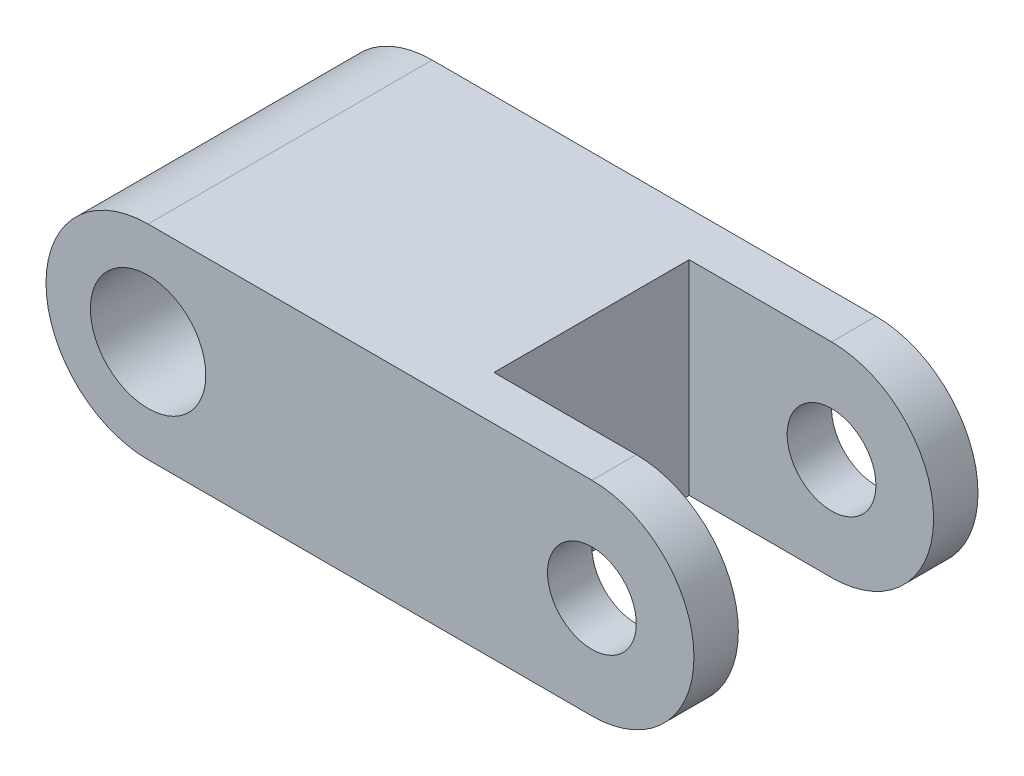
ISO-10303-21;
HEADER;
FILE_DESCRIPTION(('STEP AP214'),'2;1');
FILE_NAME('part.step','',(''),(''),'','','');
FILE_SCHEMA(('AUTOMOTIVE_DESIGN { 1 0 10303 214 1 1 1 1 }'));
ENDSEC;
DATA;
#1=APPLICATION_CONTEXT('core data for automotive mechanical design processes');
#2=APPLICATION_PROTOCOL_DEFINITION('international standard','automotive_design',2000,#1);
#3=PRODUCT_CONTEXT('',#1,'mechanical');
#4=PRODUCT('Part','Part','',(#3));
#5=PRODUCT_RELATED_PRODUCT_CATEGORY('part','',(#4));
#6=PRODUCT_DEFINITION_FORMATION('','',#4);
#7=PRODUCT_DEFINITION_CONTEXT('part definition',#1,'design');
#8=PRODUCT_DEFINITION('design','',#6,#7);
#9=PRODUCT_DEFINITION_SHAPE('','',#8);
#10=(LENGTH_UNIT() NAMED_UNIT(*) SI_UNIT(.MILLI.,.METRE.));
#11=(NAMED_UNIT(*) PLANE_ANGLE_UNIT() SI_UNIT($,.RADIAN.));
#12=(NAMED_UNIT(*) SI_UNIT($,.STERADIAN.) SOLID_ANGLE_UNIT());
#13=UNCERTAINTY_MEASURE_WITH_UNIT(LENGTH_MEASURE(1.E-05),#10,'distance_accuracy_value','');
#14=(GEOMETRIC_REPRESENTATION_CONTEXT(3) GLOBAL_UNCERTAINTY_ASSIGNED_CONTEXT((#13)) GLOBAL_UNIT_ASSIGNED_CONTEXT((#10,
#11,#12)) REPRESENTATION_CONTEXT('',''));
#15=CARTESIAN_POINT('',(0.,0.,0.));
#16=DIRECTION('',(0.,0.,1.));
#17=DIRECTION('',(1.,0.,0.));
#18=AXIS2_PLACEMENT_3D('',#15,#16,#17);
#19=CARTESIAN_POINT('',(50.,0.,-32.));
#20=DIRECTION('',(0.,0.,1.));
#21=DIRECTION('',(-1.,0.,0.));
#22=AXIS2_PLACEMENT_3D('',#19,#20,#21);
#23=CYLINDRICAL_SURFACE('',#22,11.5);
#24=DIRECTION('',(0.,0.,1.));
#25=VECTOR('',#24,1.);
#26=CARTESIAN_POINT('',(50.,-11.5,-32.));
#27=LINE('',#26,#25);
#28=CARTESIAN_POINT('',(50.,-11.5,-32.));
#29=VERTEX_POINT('',#28);
#30=CARTESIAN_POINT('',(50.,-11.5,-27.));
#31=VERTEX_POINT('',#30);
#32=EDGE_CURVE('E43',#29,#31,#27,.T.);
#33=ORIENTED_EDGE('',*,*,#32,.F.);
#34=CARTESIAN_POINT('',(50.,0.,-32.));
#35=DIRECTION('',(0.,0.,1.));
#36=DIRECTION('',(1.,0.,0.));
#37=AXIS2_PLACEMENT_3D('',#34,#35,#36);
#38=CIRCLE('',#37,11.5);
#39=CARTESIAN_POINT('',(50.,11.5,-32.));
#40=VERTEX_POINT('',#39);
#41=EDGE_CURVE('E129',#29,#40,#38,.T.);
#42=ORIENTED_EDGE('',*,*,#41,.T.);
#43=DIRECTION('',(0.,0.,1.));
#44=VECTOR('',#43,1.);
#45=CARTESIAN_POINT('',(50.,11.5,-32.));
#46=LINE('',#45,#44);
#47=CARTESIAN_POINT('',(50.,11.5,-27.));
#48=VERTEX_POINT('',#47);
#49=EDGE_CURVE('E110',#40,#48,#46,.T.);
#50=ORIENTED_EDGE('',*,*,#49,.T.);
#51=CARTESIAN_POINT('',(50.,0.,-27.));
#52=DIRECTION('',(0.,0.,1.));
#53=DIRECTION('',(1.,0.,0.));
#54=AXIS2_PLACEMENT_3D('',#51,#52,#53);
#55=CIRCLE('',#54,11.5);
#56=EDGE_CURVE('E118',#48,#31,#55,.F.);
#57=ORIENTED_EDGE('',*,*,#56,.T.);
#58=EDGE_LOOP('',(#33,#42,#50,#57));
#59=FACE_BOUND('',#58,.T.);
#60=ADVANCED_FACE('F35',(#59),#23,.T.);
#61=CARTESIAN_POINT('',(50.,0.,-32.));
#62=DIRECTION('',(0.,0.,1.));
#63=DIRECTION('',(-1.,0.,0.));
#64=AXIS2_PLACEMENT_3D('',#61,#62,#63);
#65=CYLINDRICAL_SURFACE('',#64,5.);
#66=CARTESIAN_POINT('',(50.,0.,-27.));
#67=DIRECTION('',(0.,0.,1.));
#68=DIRECTION('',(1.,0.,0.));
#69=AXIS2_PLACEMENT_3D('',#66,#67,#68);
#70=CIRCLE('',#69,5.);
#71=CARTESIAN_POINT('',(55.,0.,-27.));
#72=VERTEX_POINT('',#71);
#73=EDGE_CURVE('E179',#72,#72,#70,.F.);
#74=ORIENTED_EDGE('',*,*,#73,.F.);
#75=EDGE_LOOP('',(#74));
#76=FACE_BOUND('',#75,.T.);
#77=CARTESIAN_POINT('',(50.,0.,-32.));
#78=DIRECTION('',(0.,0.,1.));
#79=DIRECTION('',(1.,0.,0.));
#80=AXIS2_PLACEMENT_3D('',#77,#78,#79);
#81=CIRCLE('',#80,5.);
#82=CARTESIAN_POINT('',(55.,0.,-32.));
#83=VERTEX_POINT('',#82);
#84=EDGE_CURVE('E165',#83,#83,#81,.T.);
#85=ORIENTED_EDGE('',*,*,#84,.F.);
#86=EDGE_LOOP('',(#85));
#87=FACE_BOUND('',#86,.T.);
#88=ADVANCED_FACE('F212',(#76,#87),#65,.F.);
#89=CARTESIAN_POINT('',(0.,0.,-32.));
#90=DIRECTION('',(0.,0.,-1.));
#91=DIRECTION('',(1.,0.,0.));
#92=AXIS2_PLACEMENT_3D('',#89,#90,#91);
#93=PLANE('',#92);
#94=CARTESIAN_POINT('',(0.,0.,-32.));
#95=DIRECTION('',(0.,0.,1.));
#96=DIRECTION('',(1.,0.,0.));
#97=AXIS2_PLACEMENT_3D('',#94,#95,#96);
#98=CIRCLE('',#97,6.5);
#99=CARTESIAN_POINT('',(6.5,0.,-32.));
#100=VERTEX_POINT('',#99);
#101=EDGE_CURVE('E154',#100,#100,#98,.T.);
#102=ORIENTED_EDGE('',*,*,#101,.T.);
#103=EDGE_LOOP('',(#102));
#104=FACE_BOUND('',#103,.T.);
#105=CARTESIAN_POINT('',(0.,0.,-32.));
#106=DIRECTION('',(0.,0.,1.));
#107=DIRECTION('',(1.,0.,0.));
#108=AXIS2_PLACEMENT_3D('',#105,#106,#107);
#109=CIRCLE('',#108,11.5);
#110=CARTESIAN_POINT('',(0.,11.5,-32.));
#111=VERTEX_POINT('',#110);
#112=CARTESIAN_POINT('',(0.,-11.5,-32.));
#113=VERTEX_POINT('',#112);
#114=EDGE_CURVE('E141',#111,#113,#109,.T.);
#115=ORIENTED_EDGE('',*,*,#114,.F.);
#116=DIRECTION('',(-1.,0.,0.));
#117=VECTOR('',#116,1.);
#118=CARTESIAN_POINT('',(0.,11.5,-32.));
#119=LINE('',#118,#117);
#120=EDGE_CURVE('E145',#40,#111,#119,.T.);
#121=ORIENTED_EDGE('',*,*,#120,.F.);
#122=ORIENTED_EDGE('',*,*,#41,.F.);
#123=DIRECTION('',(1.,0.,0.));
#124=VECTOR('',#123,1.);
#125=CARTESIAN_POINT('',(0.,-11.5,-32.));
#126=LINE('',#125,#124);
#127=EDGE_CURVE('E138',#113,#29,#126,.T.);
#128=ORIENTED_EDGE('',*,*,#127,.F.);
#129=EDGE_LOOP('',(#115,#121,#122,#128));
#130=FACE_BOUND('',#129,.T.);
#131=ORIENTED_EDGE('',*,*,#84,.T.);
#132=EDGE_LOOP('',(#131));
#133=FACE_BOUND('',#132,.T.);
#134=ADVANCED_FACE('F143',(#104,#130,#133),#93,.T.);
#135=CARTESIAN_POINT('',(0.,0.,0.));
#136=DIRECTION('',(0.,0.,-1.));
#137=DIRECTION('',(1.,0.,0.));
#138=AXIS2_PLACEMENT_3D('',#135,#136,#137);
#139=PLANE('',#138);
#140=CARTESIAN_POINT('',(0.,0.,0.));
#141=DIRECTION('',(0.,0.,1.));
#142=DIRECTION('',(1.,0.,0.));
#143=AXIS2_PLACEMENT_3D('',#140,#141,#142);
#144=CIRCLE('',#143,11.5);
#145=CARTESIAN_POINT('',(0.,11.5,0.));
#146=VERTEX_POINT('',#145);
#147=CARTESIAN_POINT('',(0.,-11.5,0.));
#148=VERTEX_POINT('',#147);
#149=EDGE_CURVE('E150',#146,#148,#144,.T.);
#150=ORIENTED_EDGE('',*,*,#149,.T.);
#151=DIRECTION('',(1.,0.,0.));
#152=VECTOR('',#151,1.);
#153=CARTESIAN_POINT('',(0.,-11.5,0.));
#154=LINE('',#153,#152);
#155=CARTESIAN_POINT('',(50.,-11.5,0.));
#156=VERTEX_POINT('',#155);
#157=EDGE_CURVE('E153',#148,#156,#154,.T.);
#158=ORIENTED_EDGE('',*,*,#157,.T.);
#159=CARTESIAN_POINT('',(50.,0.,0.));
#160=DIRECTION('',(0.,0.,1.));
#161=DIRECTION('',(1.,0.,0.));
#162=AXIS2_PLACEMENT_3D('',#159,#160,#161);
#163=CIRCLE('',#162,11.5);
#164=CARTESIAN_POINT('',(50.,11.5,0.));
#165=VERTEX_POINT('',#164);
#166=EDGE_CURVE('E157',#156,#165,#163,.T.);
#167=ORIENTED_EDGE('',*,*,#166,.T.);
#168=DIRECTION('',(-1.,0.,0.));
#169=VECTOR('',#168,1.);
#170=CARTESIAN_POINT('',(0.,11.5,0.));
#171=LINE('',#170,#169);
#172=EDGE_CURVE('E159',#165,#146,#171,.T.);
#173=ORIENTED_EDGE('',*,*,#172,.T.);
#174=EDGE_LOOP('',(#150,#158,#167,#173));
#175=FACE_BOUND('',#174,.T.);
#176=CARTESIAN_POINT('',(0.,0.,0.));
#177=DIRECTION('',(0.,0.,1.));
#178=DIRECTION('',(1.,0.,0.));
#179=AXIS2_PLACEMENT_3D('',#176,#177,#178);
#180=CIRCLE('',#179,6.5);
#181=CARTESIAN_POINT('',(6.5,0.,0.));
#182=VERTEX_POINT('',#181);
#183=EDGE_CURVE('E162',#182,#182,#180,.T.);
#184=ORIENTED_EDGE('',*,*,#183,.F.);
#185=EDGE_LOOP('',(#184));
#186=FACE_BOUND('',#185,.T.);
#187=CARTESIAN_POINT('',(50.,0.,0.));
#188=DIRECTION('',(0.,0.,1.));
#189=DIRECTION('',(1.,0.,0.));
#190=AXIS2_PLACEMENT_3D('',#187,#188,#189);
#191=CIRCLE('',#190,5.);
#192=CARTESIAN_POINT('',(55.,0.,0.));
#193=VERTEX_POINT('',#192);
#194=EDGE_CURVE('E168',#193,#193,#191,.T.);
#195=ORIENTED_EDGE('',*,*,#194,.F.);
#196=EDGE_LOOP('',(#195));
#197=FACE_BOUND('',#196,.T.);
#198=ADVANCED_FACE('F195',(#175,#186,#197),#139,.F.);
#199=CARTESIAN_POINT('',(0.,0.,-32.));
#200=DIRECTION('',(0.,0.,1.));
#201=DIRECTION('',(-1.,0.,0.));
#202=AXIS2_PLACEMENT_3D('',#199,#200,#201);
#203=CYLINDRICAL_SURFACE('',#202,11.5);
#204=ORIENTED_EDGE('',*,*,#149,.F.);
#205=DIRECTION('',(0.,0.,1.));
#206=VECTOR('',#205,1.);
#207=CARTESIAN_POINT('',(0.,11.5,-32.));
#208=LINE('',#207,#206);
#209=EDGE_CURVE('E59',#111,#146,#208,.T.);
#210=ORIENTED_EDGE('',*,*,#209,.F.);
#211=ORIENTED_EDGE('',*,*,#114,.T.);
#212=DIRECTION('',(0.,0.,1.));
#213=VECTOR('',#212,1.);
#214=CARTESIAN_POINT('',(0.,-11.5,-32.));
#215=LINE('',#214,#213);
#216=EDGE_CURVE('E11',#113,#148,#215,.T.);
#217=ORIENTED_EDGE('',*,*,#216,.T.);
#218=EDGE_LOOP('',(#204,#210,#211,#217));
#219=FACE_BOUND('',#218,.T.);
#220=ADVANCED_FACE('F37',(#219),#203,.T.);
#221=CARTESIAN_POINT('',(0.,-11.5,-32.));
#222=DIRECTION('',(0.,1.,0.));
#223=DIRECTION('',(0.,0.,-1.));
#224=AXIS2_PLACEMENT_3D('',#221,#222,#223);
#225=PLANE('',#224);
#226=DIRECTION('',(0.,0.,1.));
#227=VECTOR('',#226,1.);
#228=CARTESIAN_POINT('',(33.9664567589803,-11.5,-5.));
#229=LINE('',#228,#227);
#230=CARTESIAN_POINT('',(33.9664567589803,-11.5,-27.));
#231=VERTEX_POINT('',#230);
#232=CARTESIAN_POINT('',(33.9664567589803,-11.5,-5.));
#233=VERTEX_POINT('',#232);
#234=EDGE_CURVE('E185',#231,#233,#229,.T.);
#235=ORIENTED_EDGE('',*,*,#234,.T.);
#236=DIRECTION('',(1.,0.,0.));
#237=VECTOR('',#236,1.);
#238=CARTESIAN_POINT('',(61.5,-11.5,-5.));
#239=LINE('',#238,#237);
#240=CARTESIAN_POINT('',(50.,-11.5,-5.));
#241=VERTEX_POINT('',#240);
#242=EDGE_CURVE('E171',#233,#241,#239,.T.);
#243=ORIENTED_EDGE('',*,*,#242,.T.);
#244=EDGE_CURVE('E130',#241,#156,#27,.T.);
#245=ORIENTED_EDGE('',*,*,#244,.T.);
#246=ORIENTED_EDGE('',*,*,#157,.F.);
#247=ORIENTED_EDGE('',*,*,#216,.F.);
#248=ORIENTED_EDGE('',*,*,#127,.T.);
#249=ORIENTED_EDGE('',*,*,#32,.T.);
#250=DIRECTION('',(-1.,0.,0.));
#251=VECTOR('',#250,1.);
#252=CARTESIAN_POINT('',(61.5,-11.5,-27.));
#253=LINE('',#252,#251);
#254=EDGE_CURVE('E121',#31,#231,#253,.T.);
#255=ORIENTED_EDGE('',*,*,#254,.T.);
#256=EDGE_LOOP('',(#235,#243,#245,#246,#247,#248,#249,#255));
#257=FACE_BOUND('',#256,.T.);
#258=ADVANCED_FACE('F136',(#257),#225,.F.);
#259=CARTESIAN_POINT('',(50.,11.5,-5.));
#260=VERTEX_POINT('',#259);
#261=EDGE_CURVE('E131',#260,#165,#46,.T.);
#262=ORIENTED_EDGE('',*,*,#261,.T.);
#263=ORIENTED_EDGE('',*,*,#166,.F.);
#264=ORIENTED_EDGE('',*,*,#244,.F.);
#265=CARTESIAN_POINT('',(50.,0.,-5.));
#266=DIRECTION('',(0.,0.,-1.));
#267=DIRECTION('',(-1.,0.,0.));
#268=AXIS2_PLACEMENT_3D('',#265,#266,#267);
#269=CIRCLE('',#268,11.5);
#270=EDGE_CURVE('E126',#241,#260,#269,.F.);
#271=ORIENTED_EDGE('',*,*,#270,.T.);
#272=EDGE_LOOP('',(#262,#263,#264,#271));
#273=FACE_BOUND('',#272,.T.);
#274=ADVANCED_FACE('F192',(#273),#23,.T.);
#275=CARTESIAN_POINT('',(0.,11.5,-32.));
#276=DIRECTION('',(0.,-1.,0.));
#277=DIRECTION('',(0.,0.,1.));
#278=AXIS2_PLACEMENT_3D('',#275,#276,#277);
#279=PLANE('',#278);
#280=ORIENTED_EDGE('',*,*,#49,.F.);
#281=ORIENTED_EDGE('',*,*,#120,.T.);
#282=ORIENTED_EDGE('',*,*,#209,.T.);
#283=ORIENTED_EDGE('',*,*,#172,.F.);
#284=ORIENTED_EDGE('',*,*,#261,.F.);
#285=DIRECTION('',(-1.,0.,0.));
#286=VECTOR('',#285,1.);
#287=CARTESIAN_POINT('',(61.5,11.5,-5.));
#288=LINE('',#287,#286);
#289=CARTESIAN_POINT('',(33.9664567589803,11.5,-5.));
#290=VERTEX_POINT('',#289);
#291=EDGE_CURVE('E50',#260,#290,#288,.T.);
#292=ORIENTED_EDGE('',*,*,#291,.T.);
#293=DIRECTION('',(0.,0.,-1.));
#294=VECTOR('',#293,1.);
#295=CARTESIAN_POINT('',(33.9664567589803,11.5,-5.));
#296=LINE('',#295,#294);
#297=CARTESIAN_POINT('',(33.9664567589803,11.5,-27.));
#298=VERTEX_POINT('',#297);
#299=EDGE_CURVE('E113',#290,#298,#296,.T.);
#300=ORIENTED_EDGE('',*,*,#299,.T.);
#301=DIRECTION('',(1.,0.,0.));
#302=VECTOR('',#301,1.);
#303=CARTESIAN_POINT('',(61.5,11.5,-27.));
#304=LINE('',#303,#302);
#305=EDGE_CURVE('E106',#298,#48,#304,.T.);
#306=ORIENTED_EDGE('',*,*,#305,.T.);
#307=EDGE_LOOP('',(#280,#281,#282,#283,#284,#292,#300,#306));
#308=FACE_BOUND('',#307,.T.);
#309=ADVANCED_FACE('F108',(#308),#279,.F.);
#310=CARTESIAN_POINT('',(0.,0.,-32.));
#311=DIRECTION('',(0.,0.,1.));
#312=DIRECTION('',(-1.,0.,0.));
#313=AXIS2_PLACEMENT_3D('',#310,#311,#312);
#314=CYLINDRICAL_SURFACE('',#313,6.5);
#315=ORIENTED_EDGE('',*,*,#101,.F.);
#316=EDGE_LOOP('',(#315));
#317=FACE_BOUND('',#316,.T.);
#318=ORIENTED_EDGE('',*,*,#183,.T.);
#319=EDGE_LOOP('',(#318));
#320=FACE_BOUND('',#319,.T.);
#321=ADVANCED_FACE('F225',(#317,#320),#314,.F.);
#322=CARTESIAN_POINT('',(50.,0.,-5.));
#323=DIRECTION('',(0.,0.,-1.));
#324=DIRECTION('',(-1.,0.,0.));
#325=AXIS2_PLACEMENT_3D('',#322,#323,#324);
#326=CIRCLE('',#325,5.);
#327=CARTESIAN_POINT('',(45.,0.,-5.));
#328=VERTEX_POINT('',#327);
#329=EDGE_CURVE('E125',#328,#328,#326,.F.);
#330=ORIENTED_EDGE('',*,*,#329,.F.);
#331=EDGE_LOOP('',(#330));
#332=FACE_BOUND('',#331,.T.);
#333=ORIENTED_EDGE('',*,*,#194,.T.);
#334=EDGE_LOOP('',(#333));
#335=FACE_BOUND('',#334,.T.);
#336=ADVANCED_FACE('F208',(#332,#335),#65,.F.);
#337=CARTESIAN_POINT('',(61.5,-11.501,-27.));
#338=DIRECTION('',(0.,0.,-1.));
#339=DIRECTION('',(1.,0.,0.));
#340=AXIS2_PLACEMENT_3D('',#337,#338,#339);
#341=PLANE('',#340);
#342=ORIENTED_EDGE('',*,*,#73,.T.);
#343=EDGE_LOOP('',(#342));
#344=FACE_BOUND('',#343,.T.);
#345=ORIENTED_EDGE('',*,*,#254,.F.);
#346=ORIENTED_EDGE('',*,*,#56,.F.);
#347=ORIENTED_EDGE('',*,*,#305,.F.);
#348=DIRECTION('',(0.,1.,0.));
#349=VECTOR('',#348,1.);
#350=CARTESIAN_POINT('',(33.9664567589803,-11.501,-27.));
#351=LINE('',#350,#349);
#352=EDGE_CURVE('E176',#231,#298,#351,.T.);
#353=ORIENTED_EDGE('',*,*,#352,.F.);
#354=EDGE_LOOP('',(#345,#346,#347,#353));
#355=FACE_BOUND('',#354,.T.);
#356=ADVANCED_FACE('F119',(#344,#355),#341,.F.);
#357=CARTESIAN_POINT('',(33.9664567589803,-11.501,-5.));
#358=DIRECTION('',(-1.,0.,0.));
#359=DIRECTION('',(0.,0.,-1.));
#360=AXIS2_PLACEMENT_3D('',#357,#358,#359);
#361=PLANE('',#360);
#362=ORIENTED_EDGE('',*,*,#234,.F.);
#363=ORIENTED_EDGE('',*,*,#352,.T.);
#364=ORIENTED_EDGE('',*,*,#299,.F.);
#365=DIRECTION('',(0.,1.,0.));
#366=VECTOR('',#365,1.);
#367=CARTESIAN_POINT('',(33.9664567589803,-11.501,-5.));
#368=LINE('',#367,#366);
#369=EDGE_CURVE('E115',#233,#290,#368,.T.);
#370=ORIENTED_EDGE('',*,*,#369,.F.);
#371=EDGE_LOOP('',(#362,#363,#364,#370));
#372=FACE_BOUND('',#371,.T.);
#373=ADVANCED_FACE('F199',(#372),#361,.F.);
#374=CARTESIAN_POINT('',(61.5,-11.501,-5.));
#375=DIRECTION('',(0.,0.,1.));
#376=DIRECTION('',(-1.,0.,0.));
#377=AXIS2_PLACEMENT_3D('',#374,#375,#376);
#378=PLANE('',#377);
#379=ORIENTED_EDGE('',*,*,#329,.T.);
#380=EDGE_LOOP('',(#379));
#381=FACE_BOUND('',#380,.T.);
#382=ORIENTED_EDGE('',*,*,#242,.F.);
#383=ORIENTED_EDGE('',*,*,#369,.T.);
#384=ORIENTED_EDGE('',*,*,#291,.F.);
#385=ORIENTED_EDGE('',*,*,#270,.F.);
#386=EDGE_LOOP('',(#382,#383,#384,#385));
#387=FACE_BOUND('',#386,.T.);
#388=ADVANCED_FACE('F197',(#381,#387),#378,.F.);
#389=CLOSED_SHELL('',(#60,#88,#134,#198,#220,#258,#274,#309,#321,#336,#356,#373,#388));
#390=MANIFOLD_SOLID_BREP('B2',#389);
#391=ADVANCED_BREP_SHAPE_REPRESENTATION('',(#18,#390),#14);
#392=SHAPE_DEFINITION_REPRESENTATION(#9,#391);
ENDSEC;
END-ISO-10303-21;
